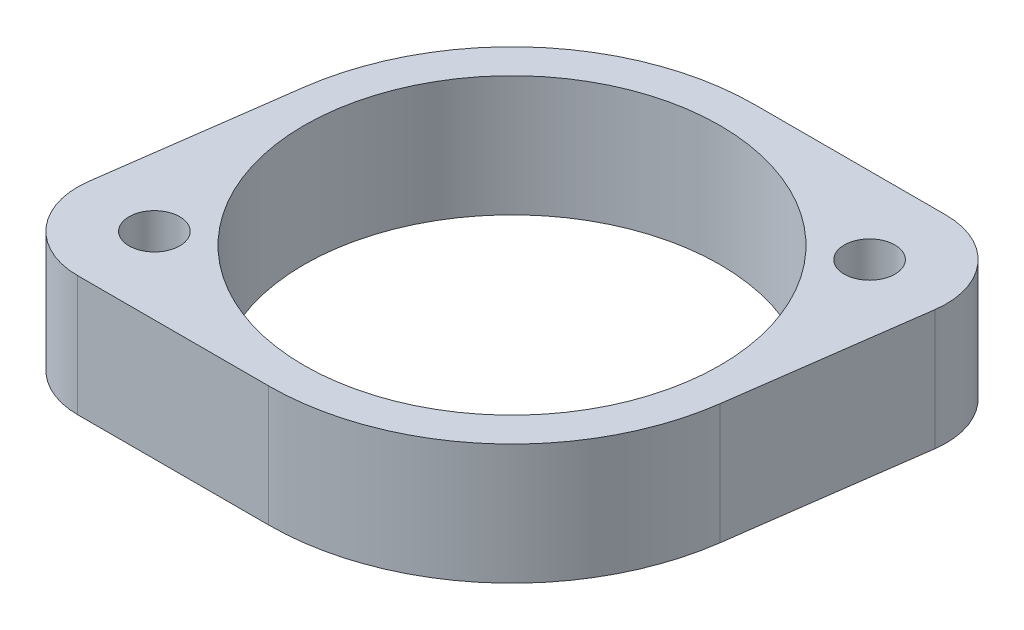
ISO-10303-21;
HEADER;
FILE_DESCRIPTION(('STEP AP214'),'2;1');
FILE_NAME('part.step','',(''),(''),'','','');
FILE_SCHEMA(('AUTOMOTIVE_DESIGN { 1 0 10303 214 1 1 1 1 }'));
ENDSEC;
DATA;
#1=APPLICATION_CONTEXT('core data for automotive mechanical design processes');
#2=APPLICATION_PROTOCOL_DEFINITION('international standard','automotive_design',2000,#1);
#3=PRODUCT_CONTEXT('',#1,'mechanical');
#4=PRODUCT('Part','Part','',(#3));
#5=PRODUCT_RELATED_PRODUCT_CATEGORY('part','',(#4));
#6=PRODUCT_DEFINITION_FORMATION('','',#4);
#7=PRODUCT_DEFINITION_CONTEXT('part definition',#1,'design');
#8=PRODUCT_DEFINITION('design','',#6,#7);
#9=PRODUCT_DEFINITION_SHAPE('','',#8);
#10=(LENGTH_UNIT() NAMED_UNIT(*) SI_UNIT(.MILLI.,.METRE.));
#11=(NAMED_UNIT(*) PLANE_ANGLE_UNIT() SI_UNIT($,.RADIAN.));
#12=(NAMED_UNIT(*) SI_UNIT($,.STERADIAN.) SOLID_ANGLE_UNIT());
#13=UNCERTAINTY_MEASURE_WITH_UNIT(LENGTH_MEASURE(1.E-05),#10,'distance_accuracy_value','');
#14=(GEOMETRIC_REPRESENTATION_CONTEXT(3) GLOBAL_UNCERTAINTY_ASSIGNED_CONTEXT((#13)) GLOBAL_UNIT_ASSIGNED_CONTEXT((#10,
#11,#12)) REPRESENTATION_CONTEXT('',''));
#15=CARTESIAN_POINT('',(0.,0.,0.));
#16=DIRECTION('',(0.,0.,1.));
#17=DIRECTION('',(1.,0.,0.));
#18=AXIS2_PLACEMENT_3D('',#15,#16,#17);
#19=CARTESIAN_POINT('',(0.,13.208,0.));
#20=DIRECTION('',(0.,1.,0.));
#21=DIRECTION('',(0.,0.,1.));
#22=AXIS2_PLACEMENT_3D('',#19,#20,#21);
#23=PLANE('',#22);
#24=CARTESIAN_POINT('',(-20.9405632087583,13.208,18.25625));
#25=DIRECTION('',(0.,1.,0.));
#26=DIRECTION('',(0.,0.,1.));
#27=AXIS2_PLACEMENT_3D('',#24,#25,#26);
#28=CIRCLE('',#27,2.77812500000001);
#29=CARTESIAN_POINT('',(-20.9405632087583,13.208,15.478125));
#30=VERTEX_POINT('',#29);
#31=EDGE_CURVE('E181',#30,#30,#28,.T.);
#32=ORIENTED_EDGE('',*,*,#31,.F.);
#33=EDGE_LOOP('',(#32));
#34=FACE_BOUND('',#33,.T.);
#35=CARTESIAN_POINT('',(0.,13.208,0.));
#36=DIRECTION('',(0.,1.,0.));
#37=DIRECTION('',(0.,0.,1.));
#38=AXIS2_PLACEMENT_3D('',#35,#36,#37);
#39=CIRCLE('',#38,26.67);
#40=CARTESIAN_POINT('',(0.,13.208,-26.67));
#41=VERTEX_POINT('',#40);
#42=CARTESIAN_POINT('',(-26.4210077513933,13.208,-3.63582857142856));
#43=VERTEX_POINT('',#42);
#44=EDGE_CURVE('E144',#41,#43,#39,.T.);
#45=ORIENTED_EDGE('',*,*,#44,.T.);
#46=DIRECTION('',(-0.136326530612245,0.,0.990663957682538));
#47=VECTOR('',#46,1.);
#48=CARTESIAN_POINT('',(-29.2757620827097,13.208,17.1092326530612));
#49=LINE('',#48,#47);
#50=CARTESIAN_POINT('',(-29.2757620827097,13.208,17.1092326530612));
#51=VERTEX_POINT('',#50);
#52=EDGE_CURVE('E92',#43,#51,#49,.T.);
#53=ORIENTED_EDGE('',*,*,#52,.T.);
#54=CARTESIAN_POINT('',(-20.9405632087583,13.208,18.25625));
#55=DIRECTION('',(0.,1.,0.));
#56=DIRECTION('',(0.,0.,1.));
#57=AXIS2_PLACEMENT_3D('',#54,#55,#56);
#58=CIRCLE('',#57,8.41375);
#59=CARTESIAN_POINT('',(-20.9405632087583,13.208,26.67));
#60=VERTEX_POINT('',#59);
#61=EDGE_CURVE('E159',#51,#60,#58,.T.);
#62=ORIENTED_EDGE('',*,*,#61,.T.);
#63=DIRECTION('',(1.,0.,0.));
#64=VECTOR('',#63,1.);
#65=CARTESIAN_POINT('',(0.,13.208,26.67));
#66=LINE('',#65,#64);
#67=CARTESIAN_POINT('',(0.,13.208,26.67));
#68=VERTEX_POINT('',#67);
#69=EDGE_CURVE('E172',#60,#68,#66,.T.);
#70=ORIENTED_EDGE('',*,*,#69,.T.);
#71=CARTESIAN_POINT('',(0.,13.208,0.));
#72=DIRECTION('',(0.,1.,0.));
#73=DIRECTION('',(0.,0.,1.));
#74=AXIS2_PLACEMENT_3D('',#71,#72,#73);
#75=CIRCLE('',#74,26.67);
#76=CARTESIAN_POINT('',(26.4210077513933,13.208,3.63582857142857));
#77=VERTEX_POINT('',#76);
#78=EDGE_CURVE('E111',#68,#77,#75,.T.);
#79=ORIENTED_EDGE('',*,*,#78,.T.);
#80=DIRECTION('',(0.136326530612246,0.,-0.990663957682537));
#81=VECTOR('',#80,1.);
#82=CARTESIAN_POINT('',(29.2757620827097,13.208,-17.1092326530612));
#83=LINE('',#82,#81);
#84=CARTESIAN_POINT('',(29.2757620827097,13.208,-17.1092326530612));
#85=VERTEX_POINT('',#84);
#86=EDGE_CURVE('E105',#77,#85,#83,.T.);
#87=ORIENTED_EDGE('',*,*,#86,.T.);
#88=CARTESIAN_POINT('',(20.9405632087583,13.208,-18.25625));
#89=DIRECTION('',(0.,1.,0.));
#90=DIRECTION('',(0.,0.,1.));
#91=AXIS2_PLACEMENT_3D('',#88,#89,#90);
#92=CIRCLE('',#91,8.41375000000001);
#93=CARTESIAN_POINT('',(20.9405632087582,13.208,-26.67));
#94=VERTEX_POINT('',#93);
#95=EDGE_CURVE('E109',#85,#94,#92,.T.);
#96=ORIENTED_EDGE('',*,*,#95,.T.);
#97=DIRECTION('',(-1.,0.,0.));
#98=VECTOR('',#97,1.);
#99=CARTESIAN_POINT('',(0.,13.208,-26.67));
#100=LINE('',#99,#98);
#101=EDGE_CURVE('E49',#94,#41,#100,.T.);
#102=ORIENTED_EDGE('',*,*,#101,.T.);
#103=EDGE_LOOP('',(#45,#53,#62,#70,#79,#87,#96,#102));
#104=FACE_BOUND('',#103,.T.);
#105=CARTESIAN_POINT('',(20.9405632087583,13.208,-18.25625));
#106=DIRECTION('',(0.,1.,0.));
#107=DIRECTION('',(0.,0.,1.));
#108=AXIS2_PLACEMENT_3D('',#105,#106,#107);
#109=CIRCLE('',#108,2.77812500000002);
#110=CARTESIAN_POINT('',(20.9405632087583,13.208,-21.034375));
#111=VERTEX_POINT('',#110);
#112=EDGE_CURVE('E133',#111,#111,#109,.T.);
#113=ORIENTED_EDGE('',*,*,#112,.F.);
#114=EDGE_LOOP('',(#113));
#115=FACE_BOUND('',#114,.T.);
#116=CARTESIAN_POINT('',(0.,13.208,0.));
#117=DIRECTION('',(0.,1.,0.));
#118=DIRECTION('',(0.,0.,1.));
#119=AXIS2_PLACEMENT_3D('',#116,#117,#118);
#120=CIRCLE('',#119,22.7877626278663);
#121=CARTESIAN_POINT('',(0.,13.208,-22.7877626278663));
#122=VERTEX_POINT('',#121);
#123=EDGE_CURVE('E187',#122,#122,#120,.T.);
#124=ORIENTED_EDGE('',*,*,#123,.F.);
#125=EDGE_LOOP('',(#124));
#126=FACE_BOUND('',#125,.T.);
#127=ADVANCED_FACE('F32',(#34,#104,#115,#126),#23,.T.);
#128=CARTESIAN_POINT('',(0.,0.,0.));
#129=DIRECTION('',(0.,1.,0.));
#130=DIRECTION('',(0.,0.,1.));
#131=AXIS2_PLACEMENT_3D('',#128,#129,#130);
#132=PLANE('',#131);
#133=CARTESIAN_POINT('',(0.,0.,0.));
#134=DIRECTION('',(0.,1.,0.));
#135=DIRECTION('',(0.,0.,1.));
#136=AXIS2_PLACEMENT_3D('',#133,#134,#135);
#137=CIRCLE('',#136,26.67);
#138=CARTESIAN_POINT('',(0.,0.,-26.67));
#139=VERTEX_POINT('',#138);
#140=CARTESIAN_POINT('',(-26.4210077513933,0.,-3.63582857142856));
#141=VERTEX_POINT('',#140);
#142=EDGE_CURVE('E129',#139,#141,#137,.T.);
#143=ORIENTED_EDGE('',*,*,#142,.F.);
#144=DIRECTION('',(-1.,0.,0.));
#145=VECTOR('',#144,1.);
#146=CARTESIAN_POINT('',(0.,0.,-26.67));
#147=LINE('',#146,#145);
#148=CARTESIAN_POINT('',(20.9405632087582,0.,-26.67));
#149=VERTEX_POINT('',#148);
#150=EDGE_CURVE('E84',#149,#139,#147,.T.);
#151=ORIENTED_EDGE('',*,*,#150,.F.);
#152=CARTESIAN_POINT('',(20.9405632087583,0.,-18.25625));
#153=DIRECTION('',(0.,1.,0.));
#154=DIRECTION('',(0.,0.,1.));
#155=AXIS2_PLACEMENT_3D('',#152,#153,#154);
#156=CIRCLE('',#155,8.41375000000001);
#157=CARTESIAN_POINT('',(29.2757620827097,0.,-17.1092326530612));
#158=VERTEX_POINT('',#157);
#159=EDGE_CURVE('E78',#158,#149,#156,.T.);
#160=ORIENTED_EDGE('',*,*,#159,.F.);
#161=DIRECTION('',(0.136326530612246,0.,-0.990663957682537));
#162=VECTOR('',#161,1.);
#163=CARTESIAN_POINT('',(29.2757620827097,0.,-17.1092326530612));
#164=LINE('',#163,#162);
#165=CARTESIAN_POINT('',(26.4210077513933,0.,3.63582857142857));
#166=VERTEX_POINT('',#165);
#167=EDGE_CURVE('E119',#166,#158,#164,.T.);
#168=ORIENTED_EDGE('',*,*,#167,.F.);
#169=CARTESIAN_POINT('',(0.,0.,0.));
#170=DIRECTION('',(0.,1.,0.));
#171=DIRECTION('',(0.,0.,1.));
#172=AXIS2_PLACEMENT_3D('',#169,#170,#171);
#173=CIRCLE('',#172,26.67);
#174=CARTESIAN_POINT('',(0.,0.,26.67));
#175=VERTEX_POINT('',#174);
#176=EDGE_CURVE('E139',#175,#166,#173,.T.);
#177=ORIENTED_EDGE('',*,*,#176,.F.);
#178=DIRECTION('',(1.,0.,0.));
#179=VECTOR('',#178,1.);
#180=CARTESIAN_POINT('',(0.,0.,26.67));
#181=LINE('',#180,#179);
#182=CARTESIAN_POINT('',(-20.9405632087583,0.,26.67));
#183=VERTEX_POINT('',#182);
#184=EDGE_CURVE('E137',#183,#175,#181,.T.);
#185=ORIENTED_EDGE('',*,*,#184,.F.);
#186=CARTESIAN_POINT('',(-20.9405632087583,0.,18.25625));
#187=DIRECTION('',(0.,1.,0.));
#188=DIRECTION('',(0.,0.,1.));
#189=AXIS2_PLACEMENT_3D('',#186,#187,#188);
#190=CIRCLE('',#189,8.41375);
#191=CARTESIAN_POINT('',(-29.2757620827097,0.,17.1092326530612));
#192=VERTEX_POINT('',#191);
#193=EDGE_CURVE('E135',#192,#183,#190,.T.);
#194=ORIENTED_EDGE('',*,*,#193,.F.);
#195=DIRECTION('',(-0.136326530612245,0.,0.990663957682538));
#196=VECTOR('',#195,1.);
#197=CARTESIAN_POINT('',(-29.2757620827097,0.,17.1092326530612));
#198=LINE('',#197,#196);
#199=EDGE_CURVE('E132',#141,#192,#198,.T.);
#200=ORIENTED_EDGE('',*,*,#199,.F.);
#201=EDGE_LOOP('',(#143,#151,#160,#168,#177,#185,#194,#200));
#202=FACE_BOUND('',#201,.T.);
#203=CARTESIAN_POINT('',(20.9405632087583,0.,-18.25625));
#204=DIRECTION('',(0.,1.,0.));
#205=DIRECTION('',(0.,0.,1.));
#206=AXIS2_PLACEMENT_3D('',#203,#204,#205);
#207=CIRCLE('',#206,2.77812500000002);
#208=CARTESIAN_POINT('',(20.9405632087583,0.,-21.034375));
#209=VERTEX_POINT('',#208);
#210=EDGE_CURVE('E178',#209,#209,#207,.T.);
#211=ORIENTED_EDGE('',*,*,#210,.T.);
#212=EDGE_LOOP('',(#211));
#213=FACE_BOUND('',#212,.T.);
#214=CARTESIAN_POINT('',(-20.9405632087583,0.,18.25625));
#215=DIRECTION('',(0.,1.,0.));
#216=DIRECTION('',(0.,0.,1.));
#217=AXIS2_PLACEMENT_3D('',#214,#215,#216);
#218=CIRCLE('',#217,2.77812500000001);
#219=CARTESIAN_POINT('',(-20.9405632087583,0.,15.478125));
#220=VERTEX_POINT('',#219);
#221=EDGE_CURVE('E184',#220,#220,#218,.T.);
#222=ORIENTED_EDGE('',*,*,#221,.T.);
#223=EDGE_LOOP('',(#222));
#224=FACE_BOUND('',#223,.T.);
#225=CARTESIAN_POINT('',(0.,0.,0.));
#226=DIRECTION('',(0.,1.,0.));
#227=DIRECTION('',(0.,0.,1.));
#228=AXIS2_PLACEMENT_3D('',#225,#226,#227);
#229=CIRCLE('',#228,22.7877626278663);
#230=CARTESIAN_POINT('',(0.,0.,-22.7877626278663));
#231=VERTEX_POINT('',#230);
#232=EDGE_CURVE('E190',#231,#231,#229,.T.);
#233=ORIENTED_EDGE('',*,*,#232,.T.);
#234=EDGE_LOOP('',(#233));
#235=FACE_BOUND('',#234,.T.);
#236=ADVANCED_FACE('F163',(#202,#213,#224,#235),#132,.F.);
#237=CARTESIAN_POINT('',(0.,13.208,0.));
#238=DIRECTION('',(0.,-1.,0.));
#239=DIRECTION('',(0.,0.,-1.));
#240=AXIS2_PLACEMENT_3D('',#237,#238,#239);
#241=CYLINDRICAL_SURFACE('',#240,26.67);
#242=ORIENTED_EDGE('',*,*,#142,.T.);
#243=DIRECTION('',(0.,-1.,0.));
#244=VECTOR('',#243,1.);
#245=CARTESIAN_POINT('',(-26.4210077513933,13.208,-3.63582857142856));
#246=LINE('',#245,#244);
#247=EDGE_CURVE('E11',#43,#141,#246,.T.);
#248=ORIENTED_EDGE('',*,*,#247,.F.);
#249=ORIENTED_EDGE('',*,*,#44,.F.);
#250=DIRECTION('',(0.,-1.,0.));
#251=VECTOR('',#250,1.);
#252=CARTESIAN_POINT('',(0.,13.208,-26.67));
#253=LINE('',#252,#251);
#254=EDGE_CURVE('E125',#41,#139,#253,.T.);
#255=ORIENTED_EDGE('',*,*,#254,.T.);
#256=EDGE_LOOP('',(#242,#248,#249,#255));
#257=FACE_BOUND('',#256,.T.);
#258=ADVANCED_FACE('F34',(#257),#241,.T.);
#259=CARTESIAN_POINT('',(-29.2757620827097,13.208,17.1092326530612));
#260=DIRECTION('',(0.990663957682538,0.,0.136326530612245));
#261=DIRECTION('',(0.136326530612245,0.,-0.990663957682538));
#262=AXIS2_PLACEMENT_3D('',#259,#260,#261);
#263=PLANE('',#262);
#264=ORIENTED_EDGE('',*,*,#199,.T.);
#265=DIRECTION('',(0.,-1.,0.));
#266=VECTOR('',#265,1.);
#267=CARTESIAN_POINT('',(-29.2757620827097,13.208,17.1092326530612));
#268=LINE('',#267,#266);
#269=EDGE_CURVE('E41',#51,#192,#268,.T.);
#270=ORIENTED_EDGE('',*,*,#269,.F.);
#271=ORIENTED_EDGE('',*,*,#52,.F.);
#272=ORIENTED_EDGE('',*,*,#247,.T.);
#273=EDGE_LOOP('',(#264,#270,#271,#272));
#274=FACE_BOUND('',#273,.T.);
#275=ADVANCED_FACE('F223',(#274),#263,.F.);
#276=CARTESIAN_POINT('',(-20.9405632087583,13.208,18.25625));
#277=DIRECTION('',(0.,-1.,0.));
#278=DIRECTION('',(0.,0.,-1.));
#279=AXIS2_PLACEMENT_3D('',#276,#277,#278);
#280=CYLINDRICAL_SURFACE('',#279,8.41375);
#281=ORIENTED_EDGE('',*,*,#193,.T.);
#282=DIRECTION('',(0.,-1.,0.));
#283=VECTOR('',#282,1.);
#284=CARTESIAN_POINT('',(-20.9405632087583,13.208,26.67));
#285=LINE('',#284,#283);
#286=EDGE_CURVE('E151',#60,#183,#285,.T.);
#287=ORIENTED_EDGE('',*,*,#286,.F.);
#288=ORIENTED_EDGE('',*,*,#61,.F.);
#289=ORIENTED_EDGE('',*,*,#269,.T.);
#290=EDGE_LOOP('',(#281,#287,#288,#289));
#291=FACE_BOUND('',#290,.T.);
#292=ADVANCED_FACE('F157',(#291),#280,.T.);
#293=CARTESIAN_POINT('',(0.,13.208,26.67));
#294=DIRECTION('',(0.,0.,-1.));
#295=DIRECTION('',(-1.,0.,0.));
#296=AXIS2_PLACEMENT_3D('',#293,#294,#295);
#297=PLANE('',#296);
#298=ORIENTED_EDGE('',*,*,#184,.T.);
#299=DIRECTION('',(0.,-1.,0.));
#300=VECTOR('',#299,1.);
#301=CARTESIAN_POINT('',(0.,13.208,26.67));
#302=LINE('',#301,#300);
#303=EDGE_CURVE('E148',#68,#175,#302,.T.);
#304=ORIENTED_EDGE('',*,*,#303,.F.);
#305=ORIENTED_EDGE('',*,*,#69,.F.);
#306=ORIENTED_EDGE('',*,*,#286,.T.);
#307=EDGE_LOOP('',(#298,#304,#305,#306));
#308=FACE_BOUND('',#307,.T.);
#309=ADVANCED_FACE('F168',(#308),#297,.F.);
#310=CARTESIAN_POINT('',(0.,13.208,0.));
#311=DIRECTION('',(0.,-1.,0.));
#312=DIRECTION('',(0.,0.,-1.));
#313=AXIS2_PLACEMENT_3D('',#310,#311,#312);
#314=CYLINDRICAL_SURFACE('',#313,26.67);
#315=ORIENTED_EDGE('',*,*,#176,.T.);
#316=DIRECTION('',(0.,-1.,0.));
#317=VECTOR('',#316,1.);
#318=CARTESIAN_POINT('',(26.4210077513933,13.208,3.63582857142857));
#319=LINE('',#318,#317);
#320=EDGE_CURVE('E120',#77,#166,#319,.T.);
#321=ORIENTED_EDGE('',*,*,#320,.F.);
#322=ORIENTED_EDGE('',*,*,#78,.F.);
#323=ORIENTED_EDGE('',*,*,#303,.T.);
#324=EDGE_LOOP('',(#315,#321,#322,#323));
#325=FACE_BOUND('',#324,.T.);
#326=ADVANCED_FACE('F171',(#325),#314,.T.);
#327=CARTESIAN_POINT('',(29.2757620827097,13.208,-17.1092326530612));
#328=DIRECTION('',(-0.990663957682537,0.,-0.136326530612247));
#329=DIRECTION('',(-0.136326530612247,0.,0.990663957682537));
#330=AXIS2_PLACEMENT_3D('',#327,#328,#329);
#331=PLANE('',#330);
#332=ORIENTED_EDGE('',*,*,#167,.T.);
#333=DIRECTION('',(0.,-1.,0.));
#334=VECTOR('',#333,1.);
#335=CARTESIAN_POINT('',(29.2757620827097,13.208,-17.1092326530612));
#336=LINE('',#335,#334);
#337=EDGE_CURVE('E116',#85,#158,#336,.T.);
#338=ORIENTED_EDGE('',*,*,#337,.F.);
#339=ORIENTED_EDGE('',*,*,#86,.F.);
#340=ORIENTED_EDGE('',*,*,#320,.T.);
#341=EDGE_LOOP('',(#332,#338,#339,#340));
#342=FACE_BOUND('',#341,.T.);
#343=ADVANCED_FACE('F117',(#342),#331,.F.);
#344=CARTESIAN_POINT('',(20.9405632087583,13.208,-18.25625));
#345=DIRECTION('',(0.,-1.,0.));
#346=DIRECTION('',(0.,0.,-1.));
#347=AXIS2_PLACEMENT_3D('',#344,#345,#346);
#348=CYLINDRICAL_SURFACE('',#347,8.41375000000001);
#349=ORIENTED_EDGE('',*,*,#159,.T.);
#350=DIRECTION('',(0.,-1.,0.));
#351=VECTOR('',#350,1.);
#352=CARTESIAN_POINT('',(20.9405632087582,13.208,-26.67));
#353=LINE('',#352,#351);
#354=EDGE_CURVE('E121',#94,#149,#353,.T.);
#355=ORIENTED_EDGE('',*,*,#354,.F.);
#356=ORIENTED_EDGE('',*,*,#95,.F.);
#357=ORIENTED_EDGE('',*,*,#337,.T.);
#358=EDGE_LOOP('',(#349,#355,#356,#357));
#359=FACE_BOUND('',#358,.T.);
#360=ADVANCED_FACE('F123',(#359),#348,.T.);
#361=CARTESIAN_POINT('',(0.,13.208,-26.67));
#362=DIRECTION('',(0.,0.,1.));
#363=DIRECTION('',(1.,0.,0.));
#364=AXIS2_PLACEMENT_3D('',#361,#362,#363);
#365=PLANE('',#364);
#366=ORIENTED_EDGE('',*,*,#150,.T.);
#367=ORIENTED_EDGE('',*,*,#254,.F.);
#368=ORIENTED_EDGE('',*,*,#101,.F.);
#369=ORIENTED_EDGE('',*,*,#354,.T.);
#370=EDGE_LOOP('',(#366,#367,#368,#369));
#371=FACE_BOUND('',#370,.T.);
#372=ADVANCED_FACE('F211',(#371),#365,.F.);
#373=CARTESIAN_POINT('',(20.9405632087583,13.208,-18.25625));
#374=DIRECTION('',(0.,-1.,0.));
#375=DIRECTION('',(0.,0.,-1.));
#376=AXIS2_PLACEMENT_3D('',#373,#374,#375);
#377=CYLINDRICAL_SURFACE('',#376,2.77812500000002);
#378=CARTESIAN_POINT('',(20.9405632087583,13.208,-21.034375));
#379=CARTESIAN_POINT('',(20.9405632087583,13.0704166666667,-21.034375));
#380=CARTESIAN_POINT('',(20.9405632087583,12.9328333333333,-21.034375));
#381=CARTESIAN_POINT('',(20.9405632087583,12.6576666666667,-21.034375));
#382=CARTESIAN_POINT('',(20.9405632087583,12.5200833333333,-21.034375));
#383=CARTESIAN_POINT('',(20.9405632087583,12.2449166666667,-21.034375));
#384=CARTESIAN_POINT('',(20.9405632087583,12.1073333333333,-21.034375));
#385=CARTESIAN_POINT('',(20.9405632087583,11.8321666666667,-21.034375));
#386=CARTESIAN_POINT('',(20.9405632087583,11.6945833333333,-21.034375));
#387=CARTESIAN_POINT('',(20.9405632087583,11.4194166666667,-21.034375));
#388=CARTESIAN_POINT('',(20.9405632087583,11.2818333333333,-21.034375));
#389=CARTESIAN_POINT('',(20.9405632087583,11.0066666666667,-21.034375));
#390=CARTESIAN_POINT('',(20.9405632087583,10.8690833333333,-21.034375));
#391=CARTESIAN_POINT('',(20.9405632087583,10.5939166666667,-21.034375));
#392=CARTESIAN_POINT('',(20.9405632087583,10.4563333333333,-21.034375));
#393=CARTESIAN_POINT('',(20.9405632087583,10.1811666666667,-21.034375));
#394=CARTESIAN_POINT('',(20.9405632087583,10.0435833333333,-21.034375));
#395=CARTESIAN_POINT('',(20.9405632087583,9.76841666666667,-21.034375));
#396=CARTESIAN_POINT('',(20.9405632087583,9.63083333333333,-21.034375));
#397=CARTESIAN_POINT('',(20.9405632087583,9.35566666666666,-21.034375));
#398=CARTESIAN_POINT('',(20.9405632087583,9.21808333333333,-21.034375));
#399=CARTESIAN_POINT('',(20.9405632087583,8.94291666666667,-21.034375));
#400=CARTESIAN_POINT('',(20.9405632087583,8.80533333333333,-21.034375));
#401=CARTESIAN_POINT('',(20.9405632087583,8.53016666666666,-21.034375));
#402=CARTESIAN_POINT('',(20.9405632087583,8.39258333333333,-21.034375));
#403=CARTESIAN_POINT('',(20.9405632087583,8.11741666666667,-21.034375));
#404=CARTESIAN_POINT('',(20.9405632087583,7.97983333333333,-21.034375));
#405=CARTESIAN_POINT('',(20.9405632087583,7.70466666666667,-21.034375));
#406=CARTESIAN_POINT('',(20.9405632087583,7.56708333333333,-21.034375));
#407=CARTESIAN_POINT('',(20.9405632087583,7.29191666666667,-21.034375));
#408=CARTESIAN_POINT('',(20.9405632087583,7.15433333333333,-21.034375));
#409=CARTESIAN_POINT('',(20.9405632087583,6.87916666666667,-21.034375));
#410=CARTESIAN_POINT('',(20.9405632087583,6.74158333333333,-21.034375));
#411=CARTESIAN_POINT('',(20.9405632087583,6.46641666666667,-21.034375));
#412=CARTESIAN_POINT('',(20.9405632087583,6.32883333333333,-21.034375));
#413=CARTESIAN_POINT('',(20.9405632087583,6.05366666666667,-21.034375));
#414=CARTESIAN_POINT('',(20.9405632087583,5.91608333333333,-21.034375));
#415=CARTESIAN_POINT('',(20.9405632087583,5.64091666666667,-21.034375));
#416=CARTESIAN_POINT('',(20.9405632087583,5.50333333333333,-21.034375));
#417=CARTESIAN_POINT('',(20.9405632087583,5.22816666666667,-21.034375));
#418=CARTESIAN_POINT('',(20.9405632087583,5.09058333333333,-21.034375));
#419=CARTESIAN_POINT('',(20.9405632087583,4.81541666666667,-21.034375));
#420=CARTESIAN_POINT('',(20.9405632087583,4.67783333333333,-21.034375));
#421=CARTESIAN_POINT('',(20.9405632087583,4.40266666666667,-21.034375));
#422=CARTESIAN_POINT('',(20.9405632087583,4.26508333333333,-21.034375));
#423=CARTESIAN_POINT('',(20.9405632087583,3.98991666666667,-21.034375));
#424=CARTESIAN_POINT('',(20.9405632087583,3.85233333333333,-21.034375));
#425=CARTESIAN_POINT('',(20.9405632087583,3.57716666666667,-21.034375));
#426=CARTESIAN_POINT('',(20.9405632087583,3.43958333333333,-21.034375));
#427=CARTESIAN_POINT('',(20.9405632087583,3.16441666666667,-21.034375));
#428=CARTESIAN_POINT('',(20.9405632087583,3.02683333333333,-21.034375));
#429=CARTESIAN_POINT('',(20.9405632087583,2.75166666666667,-21.034375));
#430=CARTESIAN_POINT('',(20.9405632087583,2.61408333333333,-21.034375));
#431=CARTESIAN_POINT('',(20.9405632087583,2.33891666666667,-21.034375));
#432=CARTESIAN_POINT('',(20.9405632087583,2.20133333333333,-21.034375));
#433=CARTESIAN_POINT('',(20.9405632087583,1.92616666666667,-21.034375));
#434=CARTESIAN_POINT('',(20.9405632087583,1.78858333333333,-21.034375));
#435=CARTESIAN_POINT('',(20.9405632087583,1.51341666666667,-21.034375));
#436=CARTESIAN_POINT('',(20.9405632087583,1.37583333333333,-21.034375));
#437=CARTESIAN_POINT('',(20.9405632087583,1.10066666666667,-21.034375));
#438=CARTESIAN_POINT('',(20.9405632087583,0.963083333333333,-21.034375));
#439=CARTESIAN_POINT('',(20.9405632087583,0.687916666666667,-21.034375));
#440=CARTESIAN_POINT('',(20.9405632087583,0.550333333333333,-21.034375));
#441=CARTESIAN_POINT('',(20.9405632087583,0.275166666666667,-21.034375));
#442=CARTESIAN_POINT('',(20.9405632087583,0.137583333333333,-21.034375));
#443=CARTESIAN_POINT('',(20.9405632087583,0.,-21.034375));
#444=B_SPLINE_CURVE_WITH_KNOTS('',3,(#378,#379,#380,#381,#382,#383,#384,#385,#386,#387,#388,
#389,#390,#391,#392,#393,#394,#395,#396,#397,#398,#399,#400,#401,#402,#403,#404,#405,#406,#407,
#408,#409,#410,#411,#412,#413,#414,#415,#416,#417,#418,#419,#420,#421,#422,#423,#424,#425,#426,
#427,#428,#429,#430,#431,#432,#433,#434,#435,#436,#437,#438,#439,#440,#441,#442,#443),
.UNSPECIFIED.,.F.,.F.,(4,2,2,2,2,2,2,2,2,2,2,2,2,2,2,2,2,2,2,2,2,2,2,2,2,2,2,2,2,2,2,2,4),(0.,
0.41275,0.8255,1.23825,1.651,2.06375,2.4765,2.88925,3.302,3.71475,4.1275,4.54025,4.953,5.36575,
5.7785,6.19125,6.604,7.01675,7.4295,7.84225,8.255,8.66775,9.0805,9.49325,9.906,10.31875,10.7315,
11.14425,11.557,11.96975,12.3825,12.79525,13.208),.UNSPECIFIED.);
#445=EDGE_CURVE('BSEAM208',#111,#209,#444,.T.);
#446=ORIENTED_EDGE('',*,*,#112,.T.);
#447=ORIENTED_EDGE('',*,*,#210,.F.);
#448=ORIENTED_EDGE('',*,*,#445,.T.);
#449=ORIENTED_EDGE('',*,*,#445,.F.);
#450=EDGE_LOOP('',(#446,#448,#447,#449));
#451=FACE_BOUND('',#450,.T.);
#452=ADVANCED_FACE('F208',(#451),#377,.F.);
#453=CARTESIAN_POINT('',(-20.9405632087583,13.208,18.25625));
#454=DIRECTION('',(0.,-1.,0.));
#455=DIRECTION('',(0.,0.,-1.));
#456=AXIS2_PLACEMENT_3D('',#453,#454,#455);
#457=CYLINDRICAL_SURFACE('',#456,2.77812500000001);
#458=CARTESIAN_POINT('',(-20.9405632087583,13.208,15.478125));
#459=CARTESIAN_POINT('',(-20.9405632087583,13.0704166666667,15.478125));
#460=CARTESIAN_POINT('',(-20.9405632087583,12.9328333333333,15.478125));
#461=CARTESIAN_POINT('',(-20.9405632087583,12.6576666666667,15.478125));
#462=CARTESIAN_POINT('',(-20.9405632087583,12.5200833333333,15.478125));
#463=CARTESIAN_POINT('',(-20.9405632087583,12.2449166666667,15.478125));
#464=CARTESIAN_POINT('',(-20.9405632087583,12.1073333333333,15.478125));
#465=CARTESIAN_POINT('',(-20.9405632087583,11.8321666666667,15.478125));
#466=CARTESIAN_POINT('',(-20.9405632087583,11.6945833333333,15.478125));
#467=CARTESIAN_POINT('',(-20.9405632087583,11.4194166666667,15.478125));
#468=CARTESIAN_POINT('',(-20.9405632087583,11.2818333333333,15.478125));
#469=CARTESIAN_POINT('',(-20.9405632087583,11.0066666666667,15.478125));
#470=CARTESIAN_POINT('',(-20.9405632087583,10.8690833333333,15.478125));
#471=CARTESIAN_POINT('',(-20.9405632087583,10.5939166666667,15.478125));
#472=CARTESIAN_POINT('',(-20.9405632087583,10.4563333333333,15.478125));
#473=CARTESIAN_POINT('',(-20.9405632087583,10.1811666666667,15.478125));
#474=CARTESIAN_POINT('',(-20.9405632087583,10.0435833333333,15.478125));
#475=CARTESIAN_POINT('',(-20.9405632087583,9.76841666666667,15.478125));
#476=CARTESIAN_POINT('',(-20.9405632087583,9.63083333333333,15.478125));
#477=CARTESIAN_POINT('',(-20.9405632087583,9.35566666666666,15.478125));
#478=CARTESIAN_POINT('',(-20.9405632087583,9.21808333333333,15.478125));
#479=CARTESIAN_POINT('',(-20.9405632087583,8.94291666666667,15.478125));
#480=CARTESIAN_POINT('',(-20.9405632087583,8.80533333333333,15.478125));
#481=CARTESIAN_POINT('',(-20.9405632087583,8.53016666666666,15.478125));
#482=CARTESIAN_POINT('',(-20.9405632087583,8.39258333333333,15.478125));
#483=CARTESIAN_POINT('',(-20.9405632087583,8.11741666666667,15.478125));
#484=CARTESIAN_POINT('',(-20.9405632087583,7.97983333333333,15.478125));
#485=CARTESIAN_POINT('',(-20.9405632087583,7.70466666666667,15.478125));
#486=CARTESIAN_POINT('',(-20.9405632087583,7.56708333333333,15.478125));
#487=CARTESIAN_POINT('',(-20.9405632087583,7.29191666666667,15.478125));
#488=CARTESIAN_POINT('',(-20.9405632087583,7.15433333333333,15.478125));
#489=CARTESIAN_POINT('',(-20.9405632087583,6.87916666666667,15.478125));
#490=CARTESIAN_POINT('',(-20.9405632087583,6.74158333333333,15.478125));
#491=CARTESIAN_POINT('',(-20.9405632087583,6.46641666666667,15.478125));
#492=CARTESIAN_POINT('',(-20.9405632087583,6.32883333333333,15.478125));
#493=CARTESIAN_POINT('',(-20.9405632087583,6.05366666666667,15.478125));
#494=CARTESIAN_POINT('',(-20.9405632087583,5.91608333333333,15.478125));
#495=CARTESIAN_POINT('',(-20.9405632087583,5.64091666666667,15.478125));
#496=CARTESIAN_POINT('',(-20.9405632087583,5.50333333333333,15.478125));
#497=CARTESIAN_POINT('',(-20.9405632087583,5.22816666666667,15.478125));
#498=CARTESIAN_POINT('',(-20.9405632087583,5.09058333333333,15.478125));
#499=CARTESIAN_POINT('',(-20.9405632087583,4.81541666666667,15.478125));
#500=CARTESIAN_POINT('',(-20.9405632087583,4.67783333333333,15.478125));
#501=CARTESIAN_POINT('',(-20.9405632087583,4.40266666666667,15.478125));
#502=CARTESIAN_POINT('',(-20.9405632087583,4.26508333333333,15.478125));
#503=CARTESIAN_POINT('',(-20.9405632087583,3.98991666666667,15.478125));
#504=CARTESIAN_POINT('',(-20.9405632087583,3.85233333333333,15.478125));
#505=CARTESIAN_POINT('',(-20.9405632087583,3.57716666666667,15.478125));
#506=CARTESIAN_POINT('',(-20.9405632087583,3.43958333333333,15.478125));
#507=CARTESIAN_POINT('',(-20.9405632087583,3.16441666666667,15.478125));
#508=CARTESIAN_POINT('',(-20.9405632087583,3.02683333333333,15.478125));
#509=CARTESIAN_POINT('',(-20.9405632087583,2.75166666666667,15.478125));
#510=CARTESIAN_POINT('',(-20.9405632087583,2.61408333333333,15.478125));
#511=CARTESIAN_POINT('',(-20.9405632087583,2.33891666666667,15.478125));
#512=CARTESIAN_POINT('',(-20.9405632087583,2.20133333333333,15.478125));
#513=CARTESIAN_POINT('',(-20.9405632087583,1.92616666666667,15.478125));
#514=CARTESIAN_POINT('',(-20.9405632087583,1.78858333333333,15.478125));
#515=CARTESIAN_POINT('',(-20.9405632087583,1.51341666666667,15.478125));
#516=CARTESIAN_POINT('',(-20.9405632087583,1.37583333333333,15.478125));
#517=CARTESIAN_POINT('',(-20.9405632087583,1.10066666666667,15.478125));
#518=CARTESIAN_POINT('',(-20.9405632087583,0.963083333333333,15.478125));
#519=CARTESIAN_POINT('',(-20.9405632087583,0.687916666666667,15.478125));
#520=CARTESIAN_POINT('',(-20.9405632087583,0.550333333333333,15.478125));
#521=CARTESIAN_POINT('',(-20.9405632087583,0.275166666666667,15.478125));
#522=CARTESIAN_POINT('',(-20.9405632087583,0.137583333333333,15.478125));
#523=CARTESIAN_POINT('',(-20.9405632087583,0.,15.478125));
#524=B_SPLINE_CURVE_WITH_KNOTS('',3,(#458,#459,#460,#461,#462,#463,#464,#465,#466,#467,#468,
#469,#470,#471,#472,#473,#474,#475,#476,#477,#478,#479,#480,#481,#482,#483,#484,#485,#486,#487,
#488,#489,#490,#491,#492,#493,#494,#495,#496,#497,#498,#499,#500,#501,#502,#503,#504,#505,#506,
#507,#508,#509,#510,#511,#512,#513,#514,#515,#516,#517,#518,#519,#520,#521,#522,#523),
.UNSPECIFIED.,.F.,.F.,(4,2,2,2,2,2,2,2,2,2,2,2,2,2,2,2,2,2,2,2,2,2,2,2,2,2,2,2,2,2,2,2,4),(0.,
0.41275,0.8255,1.23825,1.651,2.06375,2.4765,2.88925,3.302,3.71475,4.1275,4.54025,4.953,5.36575,
5.7785,6.19125,6.604,7.01675,7.4295,7.84225,8.255,8.66775,9.0805,9.49325,9.906,10.31875,10.7315,
11.14425,11.557,11.96975,12.3825,12.79525,13.208),.UNSPECIFIED.);
#525=EDGE_CURVE('BSEAM287',#30,#220,#524,.T.);
#526=ORIENTED_EDGE('',*,*,#31,.T.);
#527=ORIENTED_EDGE('',*,*,#221,.F.);
#528=ORIENTED_EDGE('',*,*,#525,.T.);
#529=ORIENTED_EDGE('',*,*,#525,.F.);
#530=EDGE_LOOP('',(#526,#528,#527,#529));
#531=FACE_BOUND('',#530,.T.);
#532=ADVANCED_FACE('F287',(#531),#457,.F.);
#533=CARTESIAN_POINT('',(0.,13.208,0.));
#534=DIRECTION('',(0.,-1.,0.));
#535=DIRECTION('',(0.,0.,-1.));
#536=AXIS2_PLACEMENT_3D('',#533,#534,#535);
#537=CYLINDRICAL_SURFACE('',#536,22.7877626278663);
#538=CARTESIAN_POINT('',(0.,13.208,-22.7877626278663));
#539=CARTESIAN_POINT('',(0.,13.0704166666667,-22.7877626278663));
#540=CARTESIAN_POINT('',(0.,12.9328333333333,-22.7877626278663));
#541=CARTESIAN_POINT('',(0.,12.6576666666667,-22.7877626278663));
#542=CARTESIAN_POINT('',(0.,12.5200833333333,-22.7877626278663));
#543=CARTESIAN_POINT('',(0.,12.2449166666667,-22.7877626278663));
#544=CARTESIAN_POINT('',(0.,12.1073333333333,-22.7877626278663));
#545=CARTESIAN_POINT('',(0.,11.8321666666667,-22.7877626278663));
#546=CARTESIAN_POINT('',(0.,11.6945833333333,-22.7877626278663));
#547=CARTESIAN_POINT('',(0.,11.4194166666667,-22.7877626278663));
#548=CARTESIAN_POINT('',(0.,11.2818333333333,-22.7877626278663));
#549=CARTESIAN_POINT('',(0.,11.0066666666667,-22.7877626278663));
#550=CARTESIAN_POINT('',(0.,10.8690833333333,-22.7877626278663));
#551=CARTESIAN_POINT('',(0.,10.5939166666667,-22.7877626278663));
#552=CARTESIAN_POINT('',(0.,10.4563333333333,-22.7877626278663));
#553=CARTESIAN_POINT('',(0.,10.1811666666667,-22.7877626278663));
#554=CARTESIAN_POINT('',(0.,10.0435833333333,-22.7877626278663));
#555=CARTESIAN_POINT('',(0.,9.76841666666667,-22.7877626278663));
#556=CARTESIAN_POINT('',(0.,9.63083333333333,-22.7877626278663));
#557=CARTESIAN_POINT('',(0.,9.35566666666666,-22.7877626278663));
#558=CARTESIAN_POINT('',(0.,9.21808333333333,-22.7877626278663));
#559=CARTESIAN_POINT('',(0.,8.94291666666667,-22.7877626278663));
#560=CARTESIAN_POINT('',(0.,8.80533333333333,-22.7877626278663));
#561=CARTESIAN_POINT('',(0.,8.53016666666666,-22.7877626278663));
#562=CARTESIAN_POINT('',(0.,8.39258333333333,-22.7877626278663));
#563=CARTESIAN_POINT('',(0.,8.11741666666667,-22.7877626278663));
#564=CARTESIAN_POINT('',(0.,7.97983333333333,-22.7877626278663));
#565=CARTESIAN_POINT('',(0.,7.70466666666667,-22.7877626278663));
#566=CARTESIAN_POINT('',(0.,7.56708333333333,-22.7877626278663));
#567=CARTESIAN_POINT('',(0.,7.29191666666667,-22.7877626278663));
#568=CARTESIAN_POINT('',(0.,7.15433333333333,-22.7877626278663));
#569=CARTESIAN_POINT('',(0.,6.87916666666667,-22.7877626278663));
#570=CARTESIAN_POINT('',(0.,6.74158333333333,-22.7877626278663));
#571=CARTESIAN_POINT('',(0.,6.46641666666667,-22.7877626278663));
#572=CARTESIAN_POINT('',(0.,6.32883333333333,-22.7877626278663));
#573=CARTESIAN_POINT('',(0.,6.05366666666667,-22.7877626278663));
#574=CARTESIAN_POINT('',(0.,5.91608333333333,-22.7877626278663));
#575=CARTESIAN_POINT('',(0.,5.64091666666667,-22.7877626278663));
#576=CARTESIAN_POINT('',(0.,5.50333333333333,-22.7877626278663));
#577=CARTESIAN_POINT('',(0.,5.22816666666667,-22.7877626278663));
#578=CARTESIAN_POINT('',(0.,5.09058333333333,-22.7877626278663));
#579=CARTESIAN_POINT('',(0.,4.81541666666667,-22.7877626278663));
#580=CARTESIAN_POINT('',(0.,4.67783333333333,-22.7877626278663));
#581=CARTESIAN_POINT('',(0.,4.40266666666667,-22.7877626278663));
#582=CARTESIAN_POINT('',(0.,4.26508333333333,-22.7877626278663));
#583=CARTESIAN_POINT('',(0.,3.98991666666667,-22.7877626278663));
#584=CARTESIAN_POINT('',(0.,3.85233333333333,-22.7877626278663));
#585=CARTESIAN_POINT('',(0.,3.57716666666667,-22.7877626278663));
#586=CARTESIAN_POINT('',(0.,3.43958333333333,-22.7877626278663));
#587=CARTESIAN_POINT('',(0.,3.16441666666667,-22.7877626278663));
#588=CARTESIAN_POINT('',(0.,3.02683333333333,-22.7877626278663));
#589=CARTESIAN_POINT('',(0.,2.75166666666667,-22.7877626278663));
#590=CARTESIAN_POINT('',(0.,2.61408333333333,-22.7877626278663));
#591=CARTESIAN_POINT('',(0.,2.33891666666667,-22.7877626278663));
#592=CARTESIAN_POINT('',(0.,2.20133333333333,-22.7877626278663));
#593=CARTESIAN_POINT('',(0.,1.92616666666667,-22.7877626278663));
#594=CARTESIAN_POINT('',(0.,1.78858333333333,-22.7877626278663));
#595=CARTESIAN_POINT('',(0.,1.51341666666667,-22.7877626278663));
#596=CARTESIAN_POINT('',(0.,1.37583333333333,-22.7877626278663));
#597=CARTESIAN_POINT('',(0.,1.10066666666667,-22.7877626278663));
#598=CARTESIAN_POINT('',(0.,0.963083333333333,-22.7877626278663));
#599=CARTESIAN_POINT('',(0.,0.687916666666667,-22.7877626278663));
#600=CARTESIAN_POINT('',(0.,0.550333333333333,-22.7877626278663));
#601=CARTESIAN_POINT('',(0.,0.275166666666667,-22.7877626278663));
#602=CARTESIAN_POINT('',(0.,0.137583333333333,-22.7877626278663));
#603=CARTESIAN_POINT('',(0.,0.,-22.7877626278663));
#604=B_SPLINE_CURVE_WITH_KNOTS('',3,(#538,#539,#540,#541,#542,#543,#544,#545,#546,#547,#548,
#549,#550,#551,#552,#553,#554,#555,#556,#557,#558,#559,#560,#561,#562,#563,#564,#565,#566,#567,
#568,#569,#570,#571,#572,#573,#574,#575,#576,#577,#578,#579,#580,#581,#582,#583,#584,#585,#586,
#587,#588,#589,#590,#591,#592,#593,#594,#595,#596,#597,#598,#599,#600,#601,#602,#603),
.UNSPECIFIED.,.F.,.F.,(4,2,2,2,2,2,2,2,2,2,2,2,2,2,2,2,2,2,2,2,2,2,2,2,2,2,2,2,2,2,2,2,4),(0.,
0.41275,0.8255,1.23825,1.651,2.06375,2.4765,2.88925,3.302,3.71475,4.1275,4.54025,4.953,5.36575,
5.7785,6.19125,6.604,7.01675,7.4295,7.84225,8.255,8.66775,9.0805,9.49325,9.906,10.31875,10.7315,
11.14425,11.557,11.96975,12.3825,12.79525,13.208),.UNSPECIFIED.);
#605=EDGE_CURVE('BSEAM196',#122,#231,#604,.T.);
#606=ORIENTED_EDGE('',*,*,#123,.T.);
#607=ORIENTED_EDGE('',*,*,#232,.F.);
#608=ORIENTED_EDGE('',*,*,#605,.T.);
#609=ORIENTED_EDGE('',*,*,#605,.F.);
#610=EDGE_LOOP('',(#606,#608,#607,#609));
#611=FACE_BOUND('',#610,.T.);
#612=ADVANCED_FACE('F196',(#611),#537,.F.);
#613=CLOSED_SHELL('',(#127,#236,#258,#275,#292,#309,#326,#343,#360,#372,#452,#532,#612));
#614=MANIFOLD_SOLID_BREP('B2',#613);
#615=ADVANCED_BREP_SHAPE_REPRESENTATION('',(#18,#614),#14);
#616=SHAPE_DEFINITION_REPRESENTATION(#9,#615);
ENDSEC;
END-ISO-10303-21;
